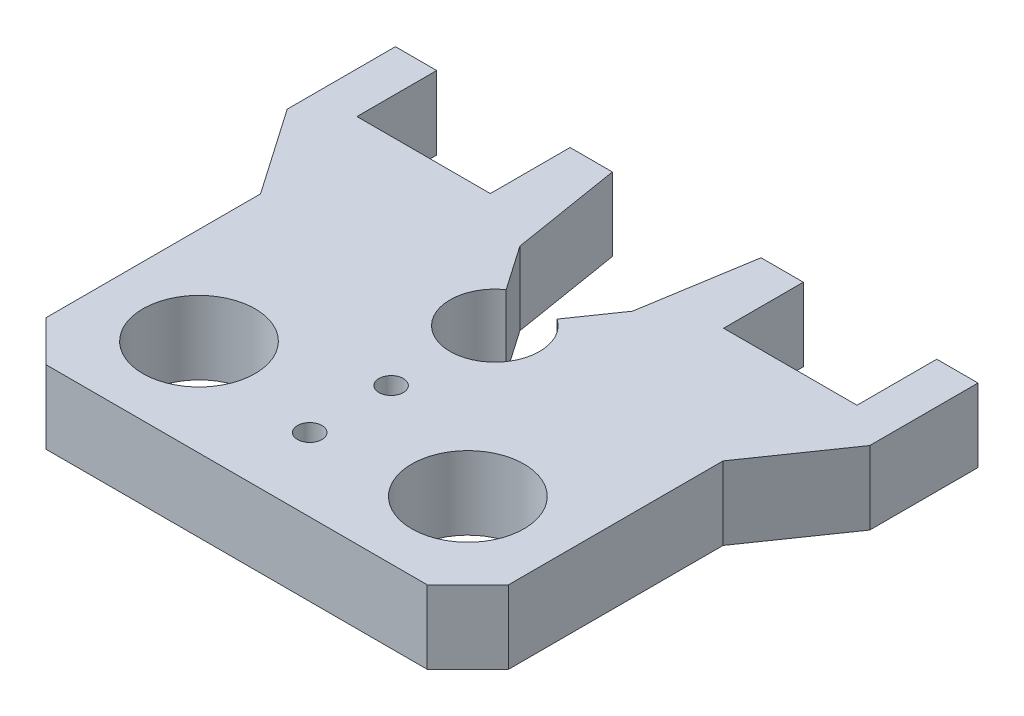
ISO-10303-21;
HEADER;
FILE_DESCRIPTION(('STEP AP214'),'2;1');
FILE_NAME('part.step','',(''),(''),'','','');
FILE_SCHEMA(('AUTOMOTIVE_DESIGN { 1 0 10303 214 1 1 1 1 }'));
ENDSEC;
DATA;
#1=APPLICATION_CONTEXT('core data for automotive mechanical design processes');
#2=APPLICATION_PROTOCOL_DEFINITION('international standard','automotive_design',2000,#1);
#3=PRODUCT_CONTEXT('',#1,'mechanical');
#4=PRODUCT('Part','Part','',(#3));
#5=PRODUCT_RELATED_PRODUCT_CATEGORY('part','',(#4));
#6=PRODUCT_DEFINITION_FORMATION('','',#4);
#7=PRODUCT_DEFINITION_CONTEXT('part definition',#1,'design');
#8=PRODUCT_DEFINITION('design','',#6,#7);
#9=PRODUCT_DEFINITION_SHAPE('','',#8);
#10=(LENGTH_UNIT() NAMED_UNIT(*) SI_UNIT(.MILLI.,.METRE.));
#11=(NAMED_UNIT(*) PLANE_ANGLE_UNIT() SI_UNIT($,.RADIAN.));
#12=(NAMED_UNIT(*) SI_UNIT($,.STERADIAN.) SOLID_ANGLE_UNIT());
#13=UNCERTAINTY_MEASURE_WITH_UNIT(LENGTH_MEASURE(1.E-05),#10,'distance_accuracy_value','');
#14=(GEOMETRIC_REPRESENTATION_CONTEXT(3) GLOBAL_UNCERTAINTY_ASSIGNED_CONTEXT((#13)) GLOBAL_UNIT_ASSIGNED_CONTEXT((#10,
#11,#12)) REPRESENTATION_CONTEXT('',''));
#15=CARTESIAN_POINT('',(0.,0.,0.));
#16=DIRECTION('',(0.,0.,1.));
#17=DIRECTION('',(1.,0.,0.));
#18=AXIS2_PLACEMENT_3D('',#15,#16,#17);
#19=CARTESIAN_POINT('',(11.7672761719998,9.,60.5704909447058));
#20=DIRECTION('',(0.,1.,0.));
#21=DIRECTION('',(0.,0.,1.));
#22=AXIS2_PLACEMENT_3D('',#19,#20,#21);
#23=PLANE('',#22);
#24=DIRECTION('',(0.,0.,-1.));
#25=VECTOR('',#24,1.);
#26=CARTESIAN_POINT('',(40.1872761719998,9.,87.3004909447059));
#27=LINE('',#26,#25);
#28=CARTESIAN_POINT('',(40.1872761719998,9.,87.3004909447059));
#29=VERTEX_POINT('',#28);
#30=CARTESIAN_POINT('',(40.1872761719998,9.,60.9362555977155));
#31=VERTEX_POINT('',#30);
#32=EDGE_CURVE('E138',#29,#31,#27,.T.);
#33=ORIENTED_EDGE('',*,*,#32,.T.);
#34=DIRECTION('',(0.569279523430837,0.,-0.822144041030742));
#35=VECTOR('',#34,1.);
#36=CARTESIAN_POINT('',(47.5604296578421,9.,50.2880696846545));
#37=LINE('',#36,#35);
#38=CARTESIAN_POINT('',(47.5604296578421,9.,50.2880696846545));
#39=VERTEX_POINT('',#38);
#40=EDGE_CURVE('E255',#31,#39,#37,.T.);
#41=ORIENTED_EDGE('',*,*,#40,.T.);
#42=DIRECTION('',(0.,0.,-1.));
#43=VECTOR('',#42,1.);
#44=CARTESIAN_POINT('',(47.560429657842,9.,36.9880696846545));
#45=LINE('',#44,#43);
#46=CARTESIAN_POINT('',(47.560429657842,9.,36.9880696846545));
#47=VERTEX_POINT('',#46);
#48=EDGE_CURVE('E284',#39,#47,#45,.T.);
#49=ORIENTED_EDGE('',*,*,#48,.T.);
#50=DIRECTION('',(-1.,0.,0.));
#51=VECTOR('',#50,1.);
#52=CARTESIAN_POINT('',(42.490429657842,9.,36.9880696846546));
#53=LINE('',#52,#51);
#54=CARTESIAN_POINT('',(42.490429657842,9.,36.9880696846546));
#55=VERTEX_POINT('',#54);
#56=EDGE_CURVE('E287',#47,#55,#53,.T.);
#57=ORIENTED_EDGE('',*,*,#56,.T.);
#58=DIRECTION('',(0.,0.,1.));
#59=VECTOR('',#58,1.);
#60=CARTESIAN_POINT('',(42.490429657842,9.,46.7880696846546));
#61=LINE('',#60,#59);
#62=CARTESIAN_POINT('',(42.490429657842,9.,46.7880696846546));
#63=VERTEX_POINT('',#62);
#64=EDGE_CURVE('E290',#55,#63,#61,.T.);
#65=ORIENTED_EDGE('',*,*,#64,.T.);
#66=DIRECTION('',(-1.,0.,0.));
#67=VECTOR('',#66,1.);
#68=CARTESIAN_POINT('',(26.0998169413766,9.,46.7880696846546));
#69=LINE('',#68,#67);
#70=CARTESIAN_POINT('',(26.0998169413766,9.,46.7880696846546));
#71=VERTEX_POINT('',#70);
#72=EDGE_CURVE('E293',#63,#71,#69,.T.);
#73=ORIENTED_EDGE('',*,*,#72,.T.);
#74=DIRECTION('',(0.,0.,-1.));
#75=VECTOR('',#74,1.);
#76=CARTESIAN_POINT('',(26.0998169413766,9.,36.9880696846546));
#77=LINE('',#76,#75);
#78=CARTESIAN_POINT('',(26.0998169413766,9.,36.9880696846546));
#79=VERTEX_POINT('',#78);
#80=EDGE_CURVE('E296',#71,#79,#77,.T.);
#81=ORIENTED_EDGE('',*,*,#80,.T.);
#82=DIRECTION('',(-1.,0.,0.));
#83=VECTOR('',#82,1.);
#84=CARTESIAN_POINT('',(26.0998169413766,9.,36.9880696846546));
#85=LINE('',#84,#83);
#86=CARTESIAN_POINT('',(20.8998169413766,9.,36.9880696846546));
#87=VERTEX_POINT('',#86);
#88=EDGE_CURVE('E299',#79,#87,#85,.T.);
#89=ORIENTED_EDGE('',*,*,#88,.T.);
#90=DIRECTION('',(-0.160742565603823,0.,0.986996366560232));
#91=VECTOR('',#90,1.);
#92=CARTESIAN_POINT('',(20.8998169413766,9.,36.9880696846546));
#93=LINE('',#92,#91);
#94=CARTESIAN_POINT('',(18.6877791726242,9.,50.5704909447058));
#95=VERTEX_POINT('',#94);
#96=EDGE_CURVE('E302',#87,#95,#93,.T.);
#97=ORIENTED_EDGE('',*,*,#96,.T.);
#98=DIRECTION('',(-0.569066893874564,0.,0.822291232043706));
#99=VECTOR('',#98,1.);
#100=CARTESIAN_POINT('',(14.8971440883099,9.,56.0478891684654));
#101=LINE('',#100,#99);
#102=CARTESIAN_POINT('',(14.8971440883099,9.,56.0478891684654));
#103=VERTEX_POINT('',#102);
#104=EDGE_CURVE('E59',#95,#103,#101,.T.);
#105=ORIENTED_EDGE('',*,*,#104,.T.);
#106=CARTESIAN_POINT('',(11.7672761719998,9.,60.5704909447058));
#107=DIRECTION('',(0.,-1.,0.));
#108=DIRECTION('',(0.,0.,1.));
#109=AXIS2_PLACEMENT_3D('',#106,#107,#108);
#110=CIRCLE('',#109,5.5);
#111=CARTESIAN_POINT('',(8.63740825568969,9.,56.0478891684654));
#112=VERTEX_POINT('',#111);
#113=EDGE_CURVE('E162',#103,#112,#110,.T.);
#114=ORIENTED_EDGE('',*,*,#113,.T.);
#115=DIRECTION('',(-0.569066893874564,0.,-0.822291232043706));
#116=VECTOR('',#115,1.);
#117=CARTESIAN_POINT('',(8.63740825568969,9.,56.0478891684654));
#118=LINE('',#117,#116);
#119=CARTESIAN_POINT('',(4.84677317137533,9.,50.5704909447058));
#120=VERTEX_POINT('',#119);
#121=EDGE_CURVE('E101',#112,#120,#118,.T.);
#122=ORIENTED_EDGE('',*,*,#121,.T.);
#123=DIRECTION('',(-0.160742565603823,0.,-0.986996366560232));
#124=VECTOR('',#123,1.);
#125=CARTESIAN_POINT('',(2.63473540262301,9.,36.9880696846546));
#126=LINE('',#125,#124);
#127=CARTESIAN_POINT('',(2.63473540262301,9.,36.9880696846546));
#128=VERTEX_POINT('',#127);
#129=EDGE_CURVE('E181',#120,#128,#126,.T.);
#130=ORIENTED_EDGE('',*,*,#129,.T.);
#131=DIRECTION('',(-1.,0.,0.));
#132=VECTOR('',#131,1.);
#133=CARTESIAN_POINT('',(-2.565264597377,9.,36.9880696846546));
#134=LINE('',#133,#132);
#135=CARTESIAN_POINT('',(-2.565264597377,9.,36.9880696846546));
#136=VERTEX_POINT('',#135);
#137=EDGE_CURVE('E222',#128,#136,#134,.T.);
#138=ORIENTED_EDGE('',*,*,#137,.T.);
#139=DIRECTION('',(0.,0.,1.));
#140=VECTOR('',#139,1.);
#141=CARTESIAN_POINT('',(-2.565264597377,9.,36.9880696846546));
#142=LINE('',#141,#140);
#143=CARTESIAN_POINT('',(-2.565264597377,9.,46.7880696846546));
#144=VERTEX_POINT('',#143);
#145=EDGE_CURVE('E225',#136,#144,#142,.T.);
#146=ORIENTED_EDGE('',*,*,#145,.T.);
#147=DIRECTION('',(-1.,0.,0.));
#148=VECTOR('',#147,1.);
#149=CARTESIAN_POINT('',(-2.565264597377,9.,46.7880696846546));
#150=LINE('',#149,#148);
#151=CARTESIAN_POINT('',(-18.9558773138425,9.,46.7880696846546));
#152=VERTEX_POINT('',#151);
#153=EDGE_CURVE('E228',#144,#152,#150,.T.);
#154=ORIENTED_EDGE('',*,*,#153,.T.);
#155=DIRECTION('',(0.,0.,-1.));
#156=VECTOR('',#155,1.);
#157=CARTESIAN_POINT('',(-18.9558773138425,9.,46.7880696846546));
#158=LINE('',#157,#156);
#159=CARTESIAN_POINT('',(-18.9558773138425,9.,36.9880696846546));
#160=VERTEX_POINT('',#159);
#161=EDGE_CURVE('E209',#152,#160,#158,.T.);
#162=ORIENTED_EDGE('',*,*,#161,.T.);
#163=DIRECTION('',(-1.,0.,0.));
#164=VECTOR('',#163,1.);
#165=CARTESIAN_POINT('',(-18.9558773138425,9.,36.9880696846546));
#166=LINE('',#165,#164);
#167=CARTESIAN_POINT('',(-24.0258773138425,9.,36.9880696846545));
#168=VERTEX_POINT('',#167);
#169=EDGE_CURVE('E212',#160,#168,#166,.T.);
#170=ORIENTED_EDGE('',*,*,#169,.T.);
#171=DIRECTION('',(0.,0.,1.));
#172=VECTOR('',#171,1.);
#173=CARTESIAN_POINT('',(-24.0258773138425,9.,36.9880696846545));
#174=LINE('',#173,#172);
#175=CARTESIAN_POINT('',(-24.0258773138425,9.,50.2880696846545));
#176=VERTEX_POINT('',#175);
#177=EDGE_CURVE('E215',#168,#176,#174,.T.);
#178=ORIENTED_EDGE('',*,*,#177,.T.);
#179=DIRECTION('',(0.569279523430836,0.,0.822144041030743));
#180=VECTOR('',#179,1.);
#181=CARTESIAN_POINT('',(-24.0258773138425,9.,50.2880696846545));
#182=LINE('',#181,#180);
#183=CARTESIAN_POINT('',(-16.6527238280002,9.,60.9362555977154));
#184=VERTEX_POINT('',#183);
#185=EDGE_CURVE('E218',#176,#184,#182,.T.);
#186=ORIENTED_EDGE('',*,*,#185,.T.);
#187=DIRECTION('',(0.,0.,1.));
#188=VECTOR('',#187,1.);
#189=CARTESIAN_POINT('',(-16.6527238280002,9.,87.3004909447059));
#190=LINE('',#189,#188);
#191=CARTESIAN_POINT('',(-16.6527238280002,9.,87.3004909447059));
#192=VERTEX_POINT('',#191);
#193=EDGE_CURVE('E50',#184,#192,#190,.T.);
#194=ORIENTED_EDGE('',*,*,#193,.T.);
#195=DIRECTION('',(0.707106781186551,0.,0.707106781186544));
#196=VECTOR('',#195,1.);
#197=CARTESIAN_POINT('',(-11.6527238280002,9.,92.3004909447058));
#198=LINE('',#197,#196);
#199=CARTESIAN_POINT('',(-11.6527238280002,9.,92.3004909447058));
#200=VERTEX_POINT('',#199);
#201=EDGE_CURVE('E120',#192,#200,#198,.T.);
#202=ORIENTED_EDGE('',*,*,#201,.T.);
#203=DIRECTION('',(1.,0.,0.));
#204=VECTOR('',#203,1.);
#205=CARTESIAN_POINT('',(-11.6527238280002,9.,92.3004909447058));
#206=LINE('',#205,#204);
#207=CARTESIAN_POINT('',(35.1872761719998,9.,92.3004909447058));
#208=VERTEX_POINT('',#207);
#209=EDGE_CURVE('E112',#200,#208,#206,.T.);
#210=ORIENTED_EDGE('',*,*,#209,.T.);
#211=DIRECTION('',(0.707106781186551,0.,-0.707106781186544));
#212=VECTOR('',#211,1.);
#213=CARTESIAN_POINT('',(35.1872761719998,9.,92.3004909447058));
#214=LINE('',#213,#212);
#215=EDGE_CURVE('E117',#208,#29,#214,.T.);
#216=ORIENTED_EDGE('',*,*,#215,.T.);
#217=EDGE_LOOP('',(#33,#41,#49,#57,#65,#73,#81,#89,#97,#105,#114,#122,#130,#138,#146,#154,#162,
#170,#178,#186,#194,#202,#210,#216));
#218=FACE_BOUND('',#217,.T.);
#219=CARTESIAN_POINT('',(-4.7527238279037,9.,80.4004909447058));
#220=DIRECTION('',(0.,1.,0.));
#221=DIRECTION('',(0.,0.,1.));
#222=AXIS2_PLACEMENT_3D('',#219,#220,#221);
#223=CIRCLE('',#222,6.9);
#224=CARTESIAN_POINT('',(-4.7527238279037,9.,87.3004909447058));
#225=VERTEX_POINT('',#224);
#226=EDGE_CURVE('E333',#225,#225,#223,.T.);
#227=ORIENTED_EDGE('',*,*,#226,.F.);
#228=EDGE_LOOP('',(#227));
#229=FACE_BOUND('',#228,.T.);
#230=CARTESIAN_POINT('',(11.7672761720007,9.,73.3154909446725));
#231=DIRECTION('',(0.,1.,0.));
#232=DIRECTION('',(0.,0.,1.));
#233=AXIS2_PLACEMENT_3D('',#230,#231,#232);
#234=CIRCLE('',#233,1.5);
#235=CARTESIAN_POINT('',(11.7672761720007,9.,74.8154909446725));
#236=VERTEX_POINT('',#235);
#237=EDGE_CURVE('E149',#236,#236,#234,.T.);
#238=ORIENTED_EDGE('',*,*,#237,.F.);
#239=EDGE_LOOP('',(#238));
#240=FACE_BOUND('',#239,.T.);
#241=CARTESIAN_POINT('',(11.7672761719998,9.,83.3154909446727));
#242=DIRECTION('',(0.,1.,0.));
#243=DIRECTION('',(0.,0.,1.));
#244=AXIS2_PLACEMENT_3D('',#241,#242,#243);
#245=CIRCLE('',#244,1.5);
#246=CARTESIAN_POINT('',(11.7672761719998,9.,84.8154909446727));
#247=VERTEX_POINT('',#246);
#248=EDGE_CURVE('E339',#247,#247,#245,.T.);
#249=ORIENTED_EDGE('',*,*,#248,.F.);
#250=EDGE_LOOP('',(#249));
#251=FACE_BOUND('',#250,.T.);
#252=CARTESIAN_POINT('',(28.2872761719033,9.,80.4004909447058));
#253=DIRECTION('',(0.,1.,0.));
#254=DIRECTION('',(0.,0.,1.));
#255=AXIS2_PLACEMENT_3D('',#252,#253,#254);
#256=CIRCLE('',#255,6.90000000015954);
#257=CARTESIAN_POINT('',(28.2872761719033,9.,87.3004909448653));
#258=VERTEX_POINT('',#257);
#259=EDGE_CURVE('E327',#258,#258,#256,.T.);
#260=ORIENTED_EDGE('',*,*,#259,.F.);
#261=EDGE_LOOP('',(#260));
#262=FACE_BOUND('',#261,.T.);
#263=ADVANCED_FACE('F35',(#218,#229,#240,#251,#262),#23,.T.);
#264=CARTESIAN_POINT('',(11.7672761719998,0.,60.5704909447058));
#265=DIRECTION('',(0.,1.,0.));
#266=DIRECTION('',(0.,0.,1.));
#267=AXIS2_PLACEMENT_3D('',#264,#265,#266);
#268=PLANE('',#267);
#269=CARTESIAN_POINT('',(-4.7527238279037,0.,80.4004909447058));
#270=DIRECTION('',(0.,1.,0.));
#271=DIRECTION('',(0.,0.,1.));
#272=AXIS2_PLACEMENT_3D('',#269,#270,#271);
#273=CIRCLE('',#272,6.9);
#274=CARTESIAN_POINT('',(-4.7527238279037,0.,87.3004909447058));
#275=VERTEX_POINT('',#274);
#276=EDGE_CURVE('E330',#275,#275,#273,.T.);
#277=ORIENTED_EDGE('',*,*,#276,.T.);
#278=EDGE_LOOP('',(#277));
#279=FACE_BOUND('',#278,.T.);
#280=CARTESIAN_POINT('',(11.7672761720007,0.,73.3154909446725));
#281=DIRECTION('',(0.,1.,0.));
#282=DIRECTION('',(0.,0.,1.));
#283=AXIS2_PLACEMENT_3D('',#280,#281,#282);
#284=CIRCLE('',#283,1.5);
#285=CARTESIAN_POINT('',(11.7672761720007,0.,74.8154909446725));
#286=VERTEX_POINT('',#285);
#287=EDGE_CURVE('E342',#286,#286,#284,.T.);
#288=ORIENTED_EDGE('',*,*,#287,.T.);
#289=EDGE_LOOP('',(#288));
#290=FACE_BOUND('',#289,.T.);
#291=CARTESIAN_POINT('',(11.7672761719998,0.,60.5704909447058));
#292=DIRECTION('',(0.,-1.,0.));
#293=DIRECTION('',(0.,0.,1.));
#294=AXIS2_PLACEMENT_3D('',#291,#292,#293);
#295=CIRCLE('',#294,5.5);
#296=CARTESIAN_POINT('',(14.8971440883099,0.,56.0478891684654));
#297=VERTEX_POINT('',#296);
#298=CARTESIAN_POINT('',(8.63740825568969,0.,56.0478891684654));
#299=VERTEX_POINT('',#298);
#300=EDGE_CURVE('E145',#297,#299,#295,.T.);
#301=ORIENTED_EDGE('',*,*,#300,.F.);
#302=DIRECTION('',(-0.569066893874564,0.,0.822291232043706));
#303=VECTOR('',#302,1.);
#304=CARTESIAN_POINT('',(14.8971440883099,0.,56.0478891684654));
#305=LINE('',#304,#303);
#306=CARTESIAN_POINT('',(18.6877791726242,0.,50.5704909447058));
#307=VERTEX_POINT('',#306);
#308=EDGE_CURVE('E93',#307,#297,#305,.T.);
#309=ORIENTED_EDGE('',*,*,#308,.F.);
#310=DIRECTION('',(0.160742565603823,0.,-0.986996366560232));
#311=VECTOR('',#310,1.);
#312=CARTESIAN_POINT('',(20.8998169413766,0.,36.9880696846546));
#313=LINE('',#312,#311);
#314=CARTESIAN_POINT('',(20.8998169413766,0.,36.9880696846546));
#315=VERTEX_POINT('',#314);
#316=EDGE_CURVE('E278',#307,#315,#313,.T.);
#317=ORIENTED_EDGE('',*,*,#316,.T.);
#318=DIRECTION('',(1.,0.,0.));
#319=VECTOR('',#318,1.);
#320=CARTESIAN_POINT('',(26.0998169413766,0.,36.9880696846546));
#321=LINE('',#320,#319);
#322=CARTESIAN_POINT('',(26.0998169413766,0.,36.9880696846546));
#323=VERTEX_POINT('',#322);
#324=EDGE_CURVE('E275',#315,#323,#321,.T.);
#325=ORIENTED_EDGE('',*,*,#324,.T.);
#326=DIRECTION('',(0.,0.,1.));
#327=VECTOR('',#326,1.);
#328=CARTESIAN_POINT('',(26.0998169413766,0.,36.9880696846546));
#329=LINE('',#328,#327);
#330=CARTESIAN_POINT('',(26.0998169413766,0.,46.7880696846546));
#331=VERTEX_POINT('',#330);
#332=EDGE_CURVE('E272',#323,#331,#329,.T.);
#333=ORIENTED_EDGE('',*,*,#332,.T.);
#334=DIRECTION('',(1.,0.,0.));
#335=VECTOR('',#334,1.);
#336=CARTESIAN_POINT('',(26.0998169413766,0.,46.7880696846546));
#337=LINE('',#336,#335);
#338=CARTESIAN_POINT('',(42.490429657842,0.,46.7880696846546));
#339=VERTEX_POINT('',#338);
#340=EDGE_CURVE('E269',#331,#339,#337,.T.);
#341=ORIENTED_EDGE('',*,*,#340,.T.);
#342=DIRECTION('',(0.,0.,-1.));
#343=VECTOR('',#342,1.);
#344=CARTESIAN_POINT('',(42.490429657842,0.,46.7880696846546));
#345=LINE('',#344,#343);
#346=CARTESIAN_POINT('',(42.490429657842,0.,36.9880696846546));
#347=VERTEX_POINT('',#346);
#348=EDGE_CURVE('E266',#339,#347,#345,.T.);
#349=ORIENTED_EDGE('',*,*,#348,.T.);
#350=DIRECTION('',(1.,0.,0.));
#351=VECTOR('',#350,1.);
#352=CARTESIAN_POINT('',(42.490429657842,0.,36.9880696846546));
#353=LINE('',#352,#351);
#354=CARTESIAN_POINT('',(47.560429657842,0.,36.9880696846545));
#355=VERTEX_POINT('',#354);
#356=EDGE_CURVE('E263',#347,#355,#353,.T.);
#357=ORIENTED_EDGE('',*,*,#356,.T.);
#358=DIRECTION('',(0.,0.,1.));
#359=VECTOR('',#358,1.);
#360=CARTESIAN_POINT('',(47.560429657842,0.,36.9880696846545));
#361=LINE('',#360,#359);
#362=CARTESIAN_POINT('',(47.5604296578421,0.,50.2880696846545));
#363=VERTEX_POINT('',#362);
#364=EDGE_CURVE('E259',#355,#363,#361,.T.);
#365=ORIENTED_EDGE('',*,*,#364,.T.);
#366=DIRECTION('',(-0.569279523430837,0.,0.822144041030742));
#367=VECTOR('',#366,1.);
#368=CARTESIAN_POINT('',(47.5604296578421,0.,50.2880696846545));
#369=LINE('',#368,#367);
#370=CARTESIAN_POINT('',(40.1872761719998,0.,60.9362555977155));
#371=VERTEX_POINT('',#370);
#372=EDGE_CURVE('E256',#363,#371,#369,.T.);
#373=ORIENTED_EDGE('',*,*,#372,.T.);
#374=DIRECTION('',(0.,0.,-1.));
#375=VECTOR('',#374,1.);
#376=CARTESIAN_POINT('',(40.1872761719998,0.,87.3004909447059));
#377=LINE('',#376,#375);
#378=CARTESIAN_POINT('',(40.1872761719998,0.,87.3004909447059));
#379=VERTEX_POINT('',#378);
#380=EDGE_CURVE('E158',#379,#371,#377,.T.);
#381=ORIENTED_EDGE('',*,*,#380,.F.);
#382=DIRECTION('',(0.707106781186551,0.,-0.707106781186544));
#383=VECTOR('',#382,1.);
#384=CARTESIAN_POINT('',(35.1872761719998,0.,92.3004909447058));
#385=LINE('',#384,#383);
#386=CARTESIAN_POINT('',(35.1872761719998,0.,92.3004909447058));
#387=VERTEX_POINT('',#386);
#388=EDGE_CURVE('E156',#387,#379,#385,.T.);
#389=ORIENTED_EDGE('',*,*,#388,.F.);
#390=DIRECTION('',(1.,0.,0.));
#391=VECTOR('',#390,1.);
#392=CARTESIAN_POINT('',(-11.6527238280002,0.,92.3004909447058));
#393=LINE('',#392,#391);
#394=CARTESIAN_POINT('',(-11.6527238280002,0.,92.3004909447058));
#395=VERTEX_POINT('',#394);
#396=EDGE_CURVE('E129',#395,#387,#393,.T.);
#397=ORIENTED_EDGE('',*,*,#396,.F.);
#398=DIRECTION('',(0.707106781186551,0.,0.707106781186544));
#399=VECTOR('',#398,1.);
#400=CARTESIAN_POINT('',(-11.6527238280002,0.,92.3004909447058));
#401=LINE('',#400,#399);
#402=CARTESIAN_POINT('',(-16.6527238280002,0.,87.3004909447059));
#403=VERTEX_POINT('',#402);
#404=EDGE_CURVE('E153',#403,#395,#401,.T.);
#405=ORIENTED_EDGE('',*,*,#404,.F.);
#406=DIRECTION('',(0.,0.,1.));
#407=VECTOR('',#406,1.);
#408=CARTESIAN_POINT('',(-16.6527238280002,0.,87.3004909447059));
#409=LINE('',#408,#407);
#410=CARTESIAN_POINT('',(-16.6527238280002,0.,60.9362555977154));
#411=VERTEX_POINT('',#410);
#412=EDGE_CURVE('E151',#411,#403,#409,.T.);
#413=ORIENTED_EDGE('',*,*,#412,.F.);
#414=DIRECTION('',(-0.569279523430836,0.,-0.822144041030743));
#415=VECTOR('',#414,1.);
#416=CARTESIAN_POINT('',(-24.0258773138425,0.,50.2880696846545));
#417=LINE('',#416,#415);
#418=CARTESIAN_POINT('',(-24.0258773138425,0.,50.2880696846545));
#419=VERTEX_POINT('',#418);
#420=EDGE_CURVE('E192',#411,#419,#417,.T.);
#421=ORIENTED_EDGE('',*,*,#420,.T.);
#422=DIRECTION('',(0.,0.,-1.));
#423=VECTOR('',#422,1.);
#424=CARTESIAN_POINT('',(-24.0258773138425,0.,36.9880696846545));
#425=LINE('',#424,#423);
#426=CARTESIAN_POINT('',(-24.0258773138425,0.,36.9880696846545));
#427=VERTEX_POINT('',#426);
#428=EDGE_CURVE('E197',#419,#427,#425,.T.);
#429=ORIENTED_EDGE('',*,*,#428,.T.);
#430=DIRECTION('',(1.,0.,0.));
#431=VECTOR('',#430,1.);
#432=CARTESIAN_POINT('',(-18.9558773138425,0.,36.9880696846546));
#433=LINE('',#432,#431);
#434=CARTESIAN_POINT('',(-18.9558773138425,0.,36.9880696846546));
#435=VERTEX_POINT('',#434);
#436=EDGE_CURVE('E208',#427,#435,#433,.T.);
#437=ORIENTED_EDGE('',*,*,#436,.T.);
#438=DIRECTION('',(0.,0.,1.));
#439=VECTOR('',#438,1.);
#440=CARTESIAN_POINT('',(-18.9558773138425,0.,46.7880696846546));
#441=LINE('',#440,#439);
#442=CARTESIAN_POINT('',(-18.9558773138425,0.,46.7880696846546));
#443=VERTEX_POINT('',#442);
#444=EDGE_CURVE('E205',#435,#443,#441,.T.);
#445=ORIENTED_EDGE('',*,*,#444,.T.);
#446=DIRECTION('',(1.,0.,0.));
#447=VECTOR('',#446,1.);
#448=CARTESIAN_POINT('',(-2.565264597377,0.,46.7880696846546));
#449=LINE('',#448,#447);
#450=CARTESIAN_POINT('',(-2.565264597377,0.,46.7880696846546));
#451=VERTEX_POINT('',#450);
#452=EDGE_CURVE('E202',#443,#451,#449,.T.);
#453=ORIENTED_EDGE('',*,*,#452,.T.);
#454=DIRECTION('',(0.,0.,-1.));
#455=VECTOR('',#454,1.);
#456=CARTESIAN_POINT('',(-2.565264597377,0.,36.9880696846546));
#457=LINE('',#456,#455);
#458=CARTESIAN_POINT('',(-2.565264597377,0.,36.9880696846546));
#459=VERTEX_POINT('',#458);
#460=EDGE_CURVE('E194',#451,#459,#457,.T.);
#461=ORIENTED_EDGE('',*,*,#460,.T.);
#462=DIRECTION('',(1.,0.,0.));
#463=VECTOR('',#462,1.);
#464=CARTESIAN_POINT('',(-2.565264597377,0.,36.9880696846546));
#465=LINE('',#464,#463);
#466=CARTESIAN_POINT('',(2.63473540262301,0.,36.9880696846546));
#467=VERTEX_POINT('',#466);
#468=EDGE_CURVE('E191',#459,#467,#465,.T.);
#469=ORIENTED_EDGE('',*,*,#468,.T.);
#470=DIRECTION('',(0.160742565603823,0.,0.986996366560233));
#471=VECTOR('',#470,1.);
#472=CARTESIAN_POINT('',(2.63473540262301,0.,36.9880696846546));
#473=LINE('',#472,#471);
#474=CARTESIAN_POINT('',(4.84677317137533,0.,50.5704909447058));
#475=VERTEX_POINT('',#474);
#476=EDGE_CURVE('E178',#467,#475,#473,.T.);
#477=ORIENTED_EDGE('',*,*,#476,.T.);
#478=DIRECTION('',(-0.569066893874564,0.,-0.822291232043706));
#479=VECTOR('',#478,1.);
#480=CARTESIAN_POINT('',(8.63740825568969,0.,56.0478891684654));
#481=LINE('',#480,#479);
#482=EDGE_CURVE('E148',#299,#475,#481,.T.);
#483=ORIENTED_EDGE('',*,*,#482,.F.);
#484=EDGE_LOOP('',(#301,#309,#317,#325,#333,#341,#349,#357,#365,#373,#381,#389,#397,#405,#413,
#421,#429,#437,#445,#453,#461,#469,#477,#483));
#485=FACE_BOUND('',#484,.T.);
#486=CARTESIAN_POINT('',(11.7672761719998,0.,83.3154909446727));
#487=DIRECTION('',(0.,1.,0.));
#488=DIRECTION('',(0.,0.,1.));
#489=AXIS2_PLACEMENT_3D('',#486,#487,#488);
#490=CIRCLE('',#489,1.5);
#491=CARTESIAN_POINT('',(11.7672761719998,0.,84.8154909446727));
#492=VERTEX_POINT('',#491);
#493=EDGE_CURVE('E336',#492,#492,#490,.T.);
#494=ORIENTED_EDGE('',*,*,#493,.T.);
#495=EDGE_LOOP('',(#494));
#496=FACE_BOUND('',#495,.T.);
#497=CARTESIAN_POINT('',(28.2872761719033,0.,80.4004909447058));
#498=DIRECTION('',(0.,1.,0.));
#499=DIRECTION('',(0.,0.,1.));
#500=AXIS2_PLACEMENT_3D('',#497,#498,#499);
#501=CIRCLE('',#500,6.90000000015954);
#502=CARTESIAN_POINT('',(28.2872761719033,0.,87.3004909448653));
#503=VERTEX_POINT('',#502);
#504=EDGE_CURVE('E281',#503,#503,#501,.T.);
#505=ORIENTED_EDGE('',*,*,#504,.T.);
#506=EDGE_LOOP('',(#505));
#507=FACE_BOUND('',#506,.T.);
#508=ADVANCED_FACE('F187',(#279,#290,#485,#496,#507),#268,.F.);
#509=CARTESIAN_POINT('',(11.7672761719998,9.,60.5704909447058));
#510=DIRECTION('',(0.,-1.,0.));
#511=DIRECTION('',(0.,0.,-1.));
#512=AXIS2_PLACEMENT_3D('',#509,#510,#511);
#513=CYLINDRICAL_SURFACE('',#512,5.5);
#514=ORIENTED_EDGE('',*,*,#300,.T.);
#515=DIRECTION('',(0.,-1.,0.));
#516=VECTOR('',#515,1.);
#517=CARTESIAN_POINT('',(8.63740825568969,9.,56.0478891684654));
#518=LINE('',#517,#516);
#519=EDGE_CURVE('E11',#112,#299,#518,.T.);
#520=ORIENTED_EDGE('',*,*,#519,.F.);
#521=ORIENTED_EDGE('',*,*,#113,.F.);
#522=DIRECTION('',(0.,-1.,0.));
#523=VECTOR('',#522,1.);
#524=CARTESIAN_POINT('',(14.8971440883099,9.,56.0478891684654));
#525=LINE('',#524,#523);
#526=EDGE_CURVE('E144',#103,#297,#525,.T.);
#527=ORIENTED_EDGE('',*,*,#526,.T.);
#528=EDGE_LOOP('',(#514,#520,#521,#527));
#529=FACE_BOUND('',#528,.T.);
#530=ADVANCED_FACE('F37',(#529),#513,.F.);
#531=CARTESIAN_POINT('',(8.63740825568969,9.,56.0478891684654));
#532=DIRECTION('',(-0.822291232043706,0.,0.569066893874564));
#533=DIRECTION('',(0.569066893874564,0.,0.822291232043706));
#534=AXIS2_PLACEMENT_3D('',#531,#532,#533);
#535=PLANE('',#534);
#536=ORIENTED_EDGE('',*,*,#482,.T.);
#537=DIRECTION('',(0.,-1.,0.));
#538=VECTOR('',#537,1.);
#539=CARTESIAN_POINT('',(4.84677317137533,9.,50.5704909447058));
#540=LINE('',#539,#538);
#541=EDGE_CURVE('E43',#120,#475,#540,.T.);
#542=ORIENTED_EDGE('',*,*,#541,.F.);
#543=ORIENTED_EDGE('',*,*,#121,.F.);
#544=ORIENTED_EDGE('',*,*,#519,.T.);
#545=EDGE_LOOP('',(#536,#542,#543,#544));
#546=FACE_BOUND('',#545,.T.);
#547=ADVANCED_FACE('F182',(#546),#535,.F.);
#548=CARTESIAN_POINT('',(-16.6527238280002,9.,87.3004909447059));
#549=DIRECTION('',(1.,0.,0.));
#550=DIRECTION('',(0.,0.,-1.));
#551=AXIS2_PLACEMENT_3D('',#548,#549,#550);
#552=PLANE('',#551);
#553=ORIENTED_EDGE('',*,*,#193,.F.);
#554=DIRECTION('',(0.,1.,0.));
#555=VECTOR('',#554,1.);
#556=CARTESIAN_POINT('',(-16.6527238280002,-37.5119388270998,60.9362555977154));
#557=LINE('',#556,#555);
#558=EDGE_CURVE('E243',#411,#184,#557,.T.);
#559=ORIENTED_EDGE('',*,*,#558,.F.);
#560=ORIENTED_EDGE('',*,*,#412,.T.);
#561=DIRECTION('',(0.,-1.,0.));
#562=VECTOR('',#561,1.);
#563=CARTESIAN_POINT('',(-16.6527238280002,9.,87.3004909447059));
#564=LINE('',#563,#562);
#565=EDGE_CURVE('E168',#192,#403,#564,.T.);
#566=ORIENTED_EDGE('',*,*,#565,.F.);
#567=EDGE_LOOP('',(#553,#559,#560,#566));
#568=FACE_BOUND('',#567,.T.);
#569=ADVANCED_FACE('F352',(#568),#552,.F.);
#570=CARTESIAN_POINT('',(-11.6527238280002,9.,92.3004909447058));
#571=DIRECTION('',(0.707106781186544,0.,-0.707106781186551));
#572=DIRECTION('',(-0.707106781186551,0.,-0.707106781186544));
#573=AXIS2_PLACEMENT_3D('',#570,#571,#572);
#574=PLANE('',#573);
#575=ORIENTED_EDGE('',*,*,#404,.T.);
#576=DIRECTION('',(0.,-1.,0.));
#577=VECTOR('',#576,1.);
#578=CARTESIAN_POINT('',(-11.6527238280002,9.,92.3004909447058));
#579=LINE('',#578,#577);
#580=EDGE_CURVE('E132',#200,#395,#579,.T.);
#581=ORIENTED_EDGE('',*,*,#580,.F.);
#582=ORIENTED_EDGE('',*,*,#201,.F.);
#583=ORIENTED_EDGE('',*,*,#565,.T.);
#584=EDGE_LOOP('',(#575,#581,#582,#583));
#585=FACE_BOUND('',#584,.T.);
#586=ADVANCED_FACE('F356',(#585),#574,.F.);
#587=CARTESIAN_POINT('',(-11.6527238280002,9.,92.3004909447058));
#588=DIRECTION('',(0.,0.,-1.));
#589=DIRECTION('',(-1.,0.,0.));
#590=AXIS2_PLACEMENT_3D('',#587,#588,#589);
#591=PLANE('',#590);
#592=ORIENTED_EDGE('',*,*,#396,.T.);
#593=DIRECTION('',(0.,-1.,0.));
#594=VECTOR('',#593,1.);
#595=CARTESIAN_POINT('',(35.1872761719998,9.,92.3004909447058));
#596=LINE('',#595,#594);
#597=EDGE_CURVE('E126',#208,#387,#596,.T.);
#598=ORIENTED_EDGE('',*,*,#597,.F.);
#599=ORIENTED_EDGE('',*,*,#209,.F.);
#600=ORIENTED_EDGE('',*,*,#580,.T.);
#601=EDGE_LOOP('',(#592,#598,#599,#600));
#602=FACE_BOUND('',#601,.T.);
#603=ADVANCED_FACE('F127',(#602),#591,.F.);
#604=CARTESIAN_POINT('',(35.1872761719998,9.,92.3004909447058));
#605=DIRECTION('',(-0.707106781186544,0.,-0.707106781186551));
#606=DIRECTION('',(-0.707106781186551,0.,0.707106781186544));
#607=AXIS2_PLACEMENT_3D('',#604,#605,#606);
#608=PLANE('',#607);
#609=ORIENTED_EDGE('',*,*,#388,.T.);
#610=DIRECTION('',(0.,-1.,0.));
#611=VECTOR('',#610,1.);
#612=CARTESIAN_POINT('',(40.1872761719998,9.,87.3004909447059));
#613=LINE('',#612,#611);
#614=EDGE_CURVE('E133',#29,#379,#613,.T.);
#615=ORIENTED_EDGE('',*,*,#614,.F.);
#616=ORIENTED_EDGE('',*,*,#215,.F.);
#617=ORIENTED_EDGE('',*,*,#597,.T.);
#618=EDGE_LOOP('',(#609,#615,#616,#617));
#619=FACE_BOUND('',#618,.T.);
#620=ADVANCED_FACE('F135',(#619),#608,.F.);
#621=CARTESIAN_POINT('',(40.1872761719998,9.,87.3004909447059));
#622=DIRECTION('',(-1.,0.,0.));
#623=DIRECTION('',(0.,0.,1.));
#624=AXIS2_PLACEMENT_3D('',#621,#622,#623);
#625=PLANE('',#624);
#626=ORIENTED_EDGE('',*,*,#380,.T.);
#627=DIRECTION('',(0.,1.,0.));
#628=VECTOR('',#627,1.);
#629=CARTESIAN_POINT('',(40.1872761719998,-37.5119388270998,60.9362555977155));
#630=LINE('',#629,#628);
#631=EDGE_CURVE('E304',#371,#31,#630,.T.);
#632=ORIENTED_EDGE('',*,*,#631,.T.);
#633=ORIENTED_EDGE('',*,*,#32,.F.);
#634=ORIENTED_EDGE('',*,*,#614,.T.);
#635=EDGE_LOOP('',(#626,#632,#633,#634));
#636=FACE_BOUND('',#635,.T.);
#637=ADVANCED_FACE('F359',(#636),#625,.F.);
#638=CARTESIAN_POINT('',(14.8971440883099,9.,56.0478891684654));
#639=DIRECTION('',(0.822291232043706,0.,0.569066893874564));
#640=DIRECTION('',(0.569066893874564,0.,-0.822291232043706));
#641=AXIS2_PLACEMENT_3D('',#638,#639,#640);
#642=PLANE('',#641);
#643=ORIENTED_EDGE('',*,*,#308,.T.);
#644=ORIENTED_EDGE('',*,*,#526,.F.);
#645=ORIENTED_EDGE('',*,*,#104,.F.);
#646=DIRECTION('',(0.,-1.,0.));
#647=VECTOR('',#646,1.);
#648=CARTESIAN_POINT('',(18.6877791726242,9.,50.5704909447058));
#649=LINE('',#648,#647);
#650=EDGE_CURVE('E164',#95,#307,#649,.T.);
#651=ORIENTED_EDGE('',*,*,#650,.T.);
#652=EDGE_LOOP('',(#643,#644,#645,#651));
#653=FACE_BOUND('',#652,.T.);
#654=ADVANCED_FACE('F430',(#653),#642,.F.);
#655=CARTESIAN_POINT('',(11.7672761720007,9.,73.3154909446725));
#656=DIRECTION('',(0.,-1.,0.));
#657=DIRECTION('',(0.,0.,-1.));
#658=AXIS2_PLACEMENT_3D('',#655,#656,#657);
#659=CYLINDRICAL_SURFACE('',#658,1.5);
#660=ORIENTED_EDGE('',*,*,#237,.T.);
#661=EDGE_LOOP('',(#660));
#662=FACE_BOUND('',#661,.T.);
#663=ORIENTED_EDGE('',*,*,#287,.F.);
#664=EDGE_LOOP('',(#663));
#665=FACE_BOUND('',#664,.T.);
#666=ADVANCED_FACE('F427',(#662,#665),#659,.F.);
#667=CARTESIAN_POINT('',(11.7672761719998,9.,83.3154909446727));
#668=DIRECTION('',(0.,-1.,0.));
#669=DIRECTION('',(0.,0.,-1.));
#670=AXIS2_PLACEMENT_3D('',#667,#668,#669);
#671=CYLINDRICAL_SURFACE('',#670,1.5);
#672=ORIENTED_EDGE('',*,*,#248,.T.);
#673=EDGE_LOOP('',(#672));
#674=FACE_BOUND('',#673,.T.);
#675=ORIENTED_EDGE('',*,*,#493,.F.);
#676=EDGE_LOOP('',(#675));
#677=FACE_BOUND('',#676,.T.);
#678=ADVANCED_FACE('F693',(#674,#677),#671,.F.);
#679=CARTESIAN_POINT('',(-4.7527238279037,9.,80.4004909447058));
#680=DIRECTION('',(0.,-1.,0.));
#681=DIRECTION('',(0.,0.,-1.));
#682=AXIS2_PLACEMENT_3D('',#679,#680,#681);
#683=CYLINDRICAL_SURFACE('',#682,6.9);
#684=ORIENTED_EDGE('',*,*,#226,.T.);
#685=EDGE_LOOP('',(#684));
#686=FACE_BOUND('',#685,.T.);
#687=ORIENTED_EDGE('',*,*,#276,.F.);
#688=EDGE_LOOP('',(#687));
#689=FACE_BOUND('',#688,.T.);
#690=ADVANCED_FACE('F700',(#686,#689),#683,.F.);
#691=CARTESIAN_POINT('',(28.2872761719033,9.,80.4004909447058));
#692=DIRECTION('',(0.,-1.,0.));
#693=DIRECTION('',(0.,0.,-1.));
#694=AXIS2_PLACEMENT_3D('',#691,#692,#693);
#695=CYLINDRICAL_SURFACE('',#694,6.90000000015954);
#696=ORIENTED_EDGE('',*,*,#259,.T.);
#697=EDGE_LOOP('',(#696));
#698=FACE_BOUND('',#697,.T.);
#699=ORIENTED_EDGE('',*,*,#504,.F.);
#700=EDGE_LOOP('',(#699));
#701=FACE_BOUND('',#700,.T.);
#702=ADVANCED_FACE('F532',(#698,#701),#695,.F.);
#703=CARTESIAN_POINT('',(20.8998169413766,-37.5119388270998,36.9880696846546));
#704=DIRECTION('',(-0.986996366560232,0.,-0.160742565603823));
#705=DIRECTION('',(-0.160742565603823,0.,0.986996366560232));
#706=AXIS2_PLACEMENT_3D('',#703,#704,#705);
#707=PLANE('',#706);
#708=ORIENTED_EDGE('',*,*,#316,.F.);
#709=ORIENTED_EDGE('',*,*,#650,.F.);
#710=ORIENTED_EDGE('',*,*,#96,.F.);
#711=DIRECTION('',(0.,1.,0.));
#712=VECTOR('',#711,1.);
#713=CARTESIAN_POINT('',(20.8998169413766,-37.5119388270998,36.9880696846546));
#714=LINE('',#713,#712);
#715=EDGE_CURVE('E260',#315,#87,#714,.T.);
#716=ORIENTED_EDGE('',*,*,#715,.F.);
#717=EDGE_LOOP('',(#708,#709,#710,#716));
#718=FACE_BOUND('',#717,.T.);
#719=ADVANCED_FACE('F459',(#718),#707,.T.);
#720=CARTESIAN_POINT('',(26.0998169413766,-37.5119388270998,36.9880696846546));
#721=DIRECTION('',(0.,0.,-1.));
#722=DIRECTION('',(-1.,0.,0.));
#723=AXIS2_PLACEMENT_3D('',#720,#721,#722);
#724=PLANE('',#723);
#725=ORIENTED_EDGE('',*,*,#324,.F.);
#726=ORIENTED_EDGE('',*,*,#715,.T.);
#727=ORIENTED_EDGE('',*,*,#88,.F.);
#728=DIRECTION('',(0.,1.,0.));
#729=VECTOR('',#728,1.);
#730=CARTESIAN_POINT('',(26.0998169413766,-37.5119388270998,36.9880696846546));
#731=LINE('',#730,#729);
#732=EDGE_CURVE('E307',#323,#79,#731,.T.);
#733=ORIENTED_EDGE('',*,*,#732,.F.);
#734=EDGE_LOOP('',(#725,#726,#727,#733));
#735=FACE_BOUND('',#734,.T.);
#736=ADVANCED_FACE('F456',(#735),#724,.T.);
#737=CARTESIAN_POINT('',(26.0998169413766,-37.5119388270998,36.9880696846546));
#738=DIRECTION('',(1.,0.,0.));
#739=DIRECTION('',(0.,0.,-1.));
#740=AXIS2_PLACEMENT_3D('',#737,#738,#739);
#741=PLANE('',#740);
#742=ORIENTED_EDGE('',*,*,#332,.F.);
#743=ORIENTED_EDGE('',*,*,#732,.T.);
#744=ORIENTED_EDGE('',*,*,#80,.F.);
#745=DIRECTION('',(0.,1.,0.));
#746=VECTOR('',#745,1.);
#747=CARTESIAN_POINT('',(26.0998169413766,-37.5119388270998,46.7880696846546));
#748=LINE('',#747,#746);
#749=EDGE_CURVE('E310',#331,#71,#748,.T.);
#750=ORIENTED_EDGE('',*,*,#749,.F.);
#751=EDGE_LOOP('',(#742,#743,#744,#750));
#752=FACE_BOUND('',#751,.T.);
#753=ADVANCED_FACE('F535',(#752),#741,.T.);
#754=CARTESIAN_POINT('',(26.0998169413766,-37.5119388270998,46.7880696846546));
#755=DIRECTION('',(0.,0.,-1.));
#756=DIRECTION('',(-1.,0.,0.));
#757=AXIS2_PLACEMENT_3D('',#754,#755,#756);
#758=PLANE('',#757);
#759=ORIENTED_EDGE('',*,*,#340,.F.);
#760=ORIENTED_EDGE('',*,*,#749,.T.);
#761=ORIENTED_EDGE('',*,*,#72,.F.);
#762=DIRECTION('',(0.,1.,0.));
#763=VECTOR('',#762,1.);
#764=CARTESIAN_POINT('',(42.490429657842,-37.5119388270998,46.7880696846546));
#765=LINE('',#764,#763);
#766=EDGE_CURVE('E313',#339,#63,#765,.T.);
#767=ORIENTED_EDGE('',*,*,#766,.F.);
#768=EDGE_LOOP('',(#759,#760,#761,#767));
#769=FACE_BOUND('',#768,.T.);
#770=ADVANCED_FACE('F538',(#769),#758,.T.);
#771=CARTESIAN_POINT('',(42.490429657842,-37.5119388270998,46.7880696846546));
#772=DIRECTION('',(-1.,0.,0.));
#773=DIRECTION('',(0.,0.,1.));
#774=AXIS2_PLACEMENT_3D('',#771,#772,#773);
#775=PLANE('',#774);
#776=ORIENTED_EDGE('',*,*,#348,.F.);
#777=ORIENTED_EDGE('',*,*,#766,.T.);
#778=ORIENTED_EDGE('',*,*,#64,.F.);
#779=DIRECTION('',(0.,1.,0.));
#780=VECTOR('',#779,1.);
#781=CARTESIAN_POINT('',(42.490429657842,-37.5119388270998,36.9880696846546));
#782=LINE('',#781,#780);
#783=EDGE_CURVE('E316',#347,#55,#782,.T.);
#784=ORIENTED_EDGE('',*,*,#783,.F.);
#785=EDGE_LOOP('',(#776,#777,#778,#784));
#786=FACE_BOUND('',#785,.T.);
#787=ADVANCED_FACE('F542',(#786),#775,.T.);
#788=CARTESIAN_POINT('',(42.490429657842,-37.5119388270998,36.9880696846546));
#789=DIRECTION('',(0.,0.,-1.));
#790=DIRECTION('',(-1.,0.,0.));
#791=AXIS2_PLACEMENT_3D('',#788,#789,#790);
#792=PLANE('',#791);
#793=ORIENTED_EDGE('',*,*,#356,.F.);
#794=ORIENTED_EDGE('',*,*,#783,.T.);
#795=ORIENTED_EDGE('',*,*,#56,.F.);
#796=DIRECTION('',(0.,1.,0.));
#797=VECTOR('',#796,1.);
#798=CARTESIAN_POINT('',(47.560429657842,-37.5119388270998,36.9880696846545));
#799=LINE('',#798,#797);
#800=EDGE_CURVE('E319',#355,#47,#799,.T.);
#801=ORIENTED_EDGE('',*,*,#800,.F.);
#802=EDGE_LOOP('',(#793,#794,#795,#801));
#803=FACE_BOUND('',#802,.T.);
#804=ADVANCED_FACE('F415',(#803),#792,.T.);
#805=CARTESIAN_POINT('',(47.560429657842,-37.5119388270998,36.9880696846545));
#806=DIRECTION('',(1.,0.,0.));
#807=DIRECTION('',(0.,0.,-1.));
#808=AXIS2_PLACEMENT_3D('',#805,#806,#807);
#809=PLANE('',#808);
#810=ORIENTED_EDGE('',*,*,#364,.F.);
#811=ORIENTED_EDGE('',*,*,#800,.T.);
#812=ORIENTED_EDGE('',*,*,#48,.F.);
#813=DIRECTION('',(0.,1.,0.));
#814=VECTOR('',#813,1.);
#815=CARTESIAN_POINT('',(47.5604296578421,-37.5119388270998,50.2880696846545));
#816=LINE('',#815,#814);
#817=EDGE_CURVE('E322',#363,#39,#816,.T.);
#818=ORIENTED_EDGE('',*,*,#817,.F.);
#819=EDGE_LOOP('',(#810,#811,#812,#818));
#820=FACE_BOUND('',#819,.T.);
#821=ADVANCED_FACE('F406',(#820),#809,.T.);
#822=CARTESIAN_POINT('',(47.5604296578421,-37.5119388270998,50.2880696846545));
#823=DIRECTION('',(0.822144041030742,0.,0.569279523430837));
#824=DIRECTION('',(0.569279523430837,0.,-0.822144041030742));
#825=AXIS2_PLACEMENT_3D('',#822,#823,#824);
#826=PLANE('',#825);
#827=ORIENTED_EDGE('',*,*,#372,.F.);
#828=ORIENTED_EDGE('',*,*,#817,.T.);
#829=ORIENTED_EDGE('',*,*,#40,.F.);
#830=ORIENTED_EDGE('',*,*,#631,.F.);
#831=EDGE_LOOP('',(#827,#828,#829,#830));
#832=FACE_BOUND('',#831,.T.);
#833=ADVANCED_FACE('F403',(#832),#826,.T.);
#834=CARTESIAN_POINT('',(-18.9558773138425,-37.5119388270998,46.7880696846546));
#835=DIRECTION('',(1.,0.,0.));
#836=DIRECTION('',(0.,0.,-1.));
#837=AXIS2_PLACEMENT_3D('',#834,#835,#836);
#838=PLANE('',#837);
#839=ORIENTED_EDGE('',*,*,#444,.F.);
#840=DIRECTION('',(0.,1.,0.));
#841=VECTOR('',#840,1.);
#842=CARTESIAN_POINT('',(-18.9558773138425,-37.5119388270998,36.9880696846546));
#843=LINE('',#842,#841);
#844=EDGE_CURVE('E231',#435,#160,#843,.T.);
#845=ORIENTED_EDGE('',*,*,#844,.T.);
#846=ORIENTED_EDGE('',*,*,#161,.F.);
#847=DIRECTION('',(0.,1.,0.));
#848=VECTOR('',#847,1.);
#849=CARTESIAN_POINT('',(-18.9558773138425,-37.5119388270998,46.7880696846546));
#850=LINE('',#849,#848);
#851=EDGE_CURVE('E232',#443,#152,#850,.T.);
#852=ORIENTED_EDGE('',*,*,#851,.F.);
#853=EDGE_LOOP('',(#839,#845,#846,#852));
#854=FACE_BOUND('',#853,.T.);
#855=ADVANCED_FACE('F405',(#854),#838,.T.);
#856=CARTESIAN_POINT('',(-2.565264597377,-37.5119388270998,46.7880696846546));
#857=DIRECTION('',(0.,0.,-1.));
#858=DIRECTION('',(-1.,0.,0.));
#859=AXIS2_PLACEMENT_3D('',#856,#857,#858);
#860=PLANE('',#859);
#861=ORIENTED_EDGE('',*,*,#452,.F.);
#862=ORIENTED_EDGE('',*,*,#851,.T.);
#863=ORIENTED_EDGE('',*,*,#153,.F.);
#864=DIRECTION('',(0.,1.,0.));
#865=VECTOR('',#864,1.);
#866=CARTESIAN_POINT('',(-2.565264597377,-37.5119388270998,46.7880696846546));
#867=LINE('',#866,#865);
#868=EDGE_CURVE('E235',#451,#144,#867,.T.);
#869=ORIENTED_EDGE('',*,*,#868,.F.);
#870=EDGE_LOOP('',(#861,#862,#863,#869));
#871=FACE_BOUND('',#870,.T.);
#872=ADVANCED_FACE('F412',(#871),#860,.T.);
#873=CARTESIAN_POINT('',(-2.565264597377,-37.5119388270998,36.9880696846546));
#874=DIRECTION('',(-1.,0.,0.));
#875=DIRECTION('',(0.,0.,1.));
#876=AXIS2_PLACEMENT_3D('',#873,#874,#875);
#877=PLANE('',#876);
#878=ORIENTED_EDGE('',*,*,#460,.F.);
#879=ORIENTED_EDGE('',*,*,#868,.T.);
#880=ORIENTED_EDGE('',*,*,#145,.F.);
#881=DIRECTION('',(0.,1.,0.));
#882=VECTOR('',#881,1.);
#883=CARTESIAN_POINT('',(-2.565264597377,-37.5119388270998,36.9880696846546));
#884=LINE('',#883,#882);
#885=EDGE_CURVE('E238',#459,#136,#884,.T.);
#886=ORIENTED_EDGE('',*,*,#885,.F.);
#887=EDGE_LOOP('',(#878,#879,#880,#886));
#888=FACE_BOUND('',#887,.T.);
#889=ADVANCED_FACE('F511',(#888),#877,.T.);
#890=CARTESIAN_POINT('',(-2.565264597377,-37.5119388270998,36.9880696846546));
#891=DIRECTION('',(0.,0.,-1.));
#892=DIRECTION('',(-1.,0.,0.));
#893=AXIS2_PLACEMENT_3D('',#890,#891,#892);
#894=PLANE('',#893);
#895=ORIENTED_EDGE('',*,*,#468,.F.);
#896=ORIENTED_EDGE('',*,*,#885,.T.);
#897=ORIENTED_EDGE('',*,*,#137,.F.);
#898=DIRECTION('',(0.,1.,0.));
#899=VECTOR('',#898,1.);
#900=CARTESIAN_POINT('',(2.63473540262301,-37.5119388270998,36.9880696846546));
#901=LINE('',#900,#899);
#902=EDGE_CURVE('E241',#467,#128,#901,.T.);
#903=ORIENTED_EDGE('',*,*,#902,.F.);
#904=EDGE_LOOP('',(#895,#896,#897,#903));
#905=FACE_BOUND('',#904,.T.);
#906=ADVANCED_FACE('F513',(#905),#894,.T.);
#907=CARTESIAN_POINT('',(2.63473540262301,-37.5119388270998,36.9880696846546));
#908=DIRECTION('',(0.986996366560232,0.,-0.160742565603823));
#909=DIRECTION('',(-0.160742565603823,0.,-0.986996366560233));
#910=AXIS2_PLACEMENT_3D('',#907,#908,#909);
#911=PLANE('',#910);
#912=ORIENTED_EDGE('',*,*,#476,.F.);
#913=ORIENTED_EDGE('',*,*,#902,.T.);
#914=ORIENTED_EDGE('',*,*,#129,.F.);
#915=ORIENTED_EDGE('',*,*,#541,.T.);
#916=EDGE_LOOP('',(#912,#913,#914,#915));
#917=FACE_BOUND('',#916,.T.);
#918=ADVANCED_FACE('F174',(#917),#911,.T.);
#919=CARTESIAN_POINT('',(-24.0258773138425,-37.5119388270998,50.2880696846545));
#920=DIRECTION('',(-0.822144041030743,0.,0.569279523430836));
#921=DIRECTION('',(0.569279523430836,0.,0.822144041030743));
#922=AXIS2_PLACEMENT_3D('',#919,#920,#921);
#923=PLANE('',#922);
#924=ORIENTED_EDGE('',*,*,#420,.F.);
#925=ORIENTED_EDGE('',*,*,#558,.T.);
#926=ORIENTED_EDGE('',*,*,#185,.F.);
#927=DIRECTION('',(0.,1.,0.));
#928=VECTOR('',#927,1.);
#929=CARTESIAN_POINT('',(-24.0258773138425,-37.5119388270998,50.2880696846545));
#930=LINE('',#929,#928);
#931=EDGE_CURVE('E245',#419,#176,#930,.T.);
#932=ORIENTED_EDGE('',*,*,#931,.F.);
#933=EDGE_LOOP('',(#924,#925,#926,#932));
#934=FACE_BOUND('',#933,.T.);
#935=ADVANCED_FACE('F493',(#934),#923,.T.);
#936=CARTESIAN_POINT('',(-24.0258773138425,-37.5119388270998,36.9880696846545));
#937=DIRECTION('',(-1.,0.,0.));
#938=DIRECTION('',(0.,0.,1.));
#939=AXIS2_PLACEMENT_3D('',#936,#937,#938);
#940=PLANE('',#939);
#941=ORIENTED_EDGE('',*,*,#428,.F.);
#942=ORIENTED_EDGE('',*,*,#931,.T.);
#943=ORIENTED_EDGE('',*,*,#177,.F.);
#944=DIRECTION('',(0.,1.,0.));
#945=VECTOR('',#944,1.);
#946=CARTESIAN_POINT('',(-24.0258773138425,-37.5119388270998,36.9880696846545));
#947=LINE('',#946,#945);
#948=EDGE_CURVE('E248',#427,#168,#947,.T.);
#949=ORIENTED_EDGE('',*,*,#948,.F.);
#950=EDGE_LOOP('',(#941,#942,#943,#949));
#951=FACE_BOUND('',#950,.T.);
#952=ADVANCED_FACE('F490',(#951),#940,.T.);
#953=CARTESIAN_POINT('',(-18.9558773138425,-37.5119388270998,36.9880696846546));
#954=DIRECTION('',(0.,0.,-1.));
#955=DIRECTION('',(-1.,0.,0.));
#956=AXIS2_PLACEMENT_3D('',#953,#954,#955);
#957=PLANE('',#956);
#958=ORIENTED_EDGE('',*,*,#436,.F.);
#959=ORIENTED_EDGE('',*,*,#948,.T.);
#960=ORIENTED_EDGE('',*,*,#169,.F.);
#961=ORIENTED_EDGE('',*,*,#844,.F.);
#962=EDGE_LOOP('',(#958,#959,#960,#961));
#963=FACE_BOUND('',#962,.T.);
#964=ADVANCED_FACE('F502',(#963),#957,.T.);
#965=CLOSED_SHELL('',(#263,#508,#530,#547,#569,#586,#603,#620,#637,#654,#666,#678,#690,#702,
#719,#736,#753,#770,#787,#804,#821,#833,#855,#872,#889,#906,#918,#935,#952,#964));
#966=MANIFOLD_SOLID_BREP('B2',#965);
#967=ADVANCED_BREP_SHAPE_REPRESENTATION('',(#18,#966),#14);
#968=SHAPE_DEFINITION_REPRESENTATION(#9,#967);
ENDSEC;
END-ISO-10303-21;
